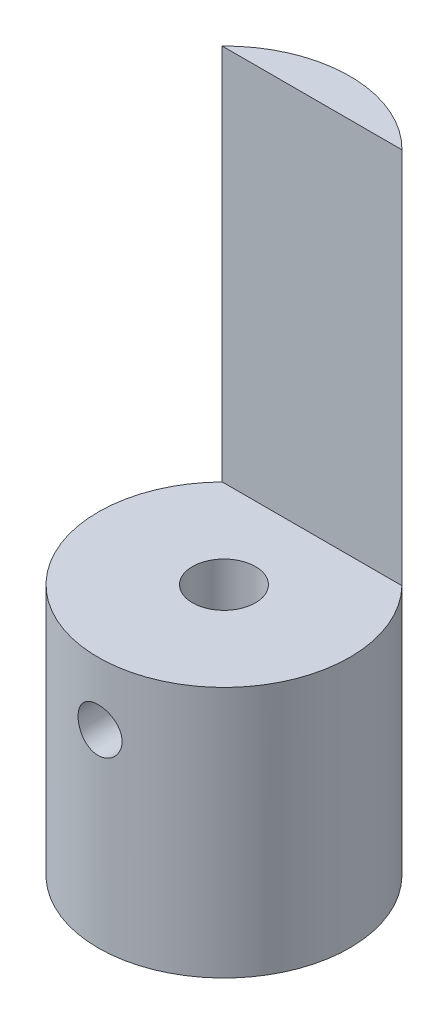
ISO-10303-21;
HEADER;
FILE_DESCRIPTION(('STEP AP214'),'2;1');
FILE_NAME('part.step','',(''),(''),'','','');
FILE_SCHEMA(('AUTOMOTIVE_DESIGN { 1 0 10303 214 1 1 1 1 }'));
ENDSEC;
DATA;
#1=APPLICATION_CONTEXT('core data for automotive mechanical design processes');
#2=APPLICATION_PROTOCOL_DEFINITION('international standard','automotive_design',2000,#1);
#3=PRODUCT_CONTEXT('',#1,'mechanical');
#4=PRODUCT('Part','Part','',(#3));
#5=PRODUCT_RELATED_PRODUCT_CATEGORY('part','',(#4));
#6=PRODUCT_DEFINITION_FORMATION('','',#4);
#7=PRODUCT_DEFINITION_CONTEXT('part definition',#1,'design');
#8=PRODUCT_DEFINITION('design','',#6,#7);
#9=PRODUCT_DEFINITION_SHAPE('','',#8);
#10=(LENGTH_UNIT() NAMED_UNIT(*) SI_UNIT(.MILLI.,.METRE.));
#11=(NAMED_UNIT(*) PLANE_ANGLE_UNIT() SI_UNIT($,.RADIAN.));
#12=(NAMED_UNIT(*) SI_UNIT($,.STERADIAN.) SOLID_ANGLE_UNIT());
#13=UNCERTAINTY_MEASURE_WITH_UNIT(LENGTH_MEASURE(1.E-05),#10,'distance_accuracy_value','');
#14=(GEOMETRIC_REPRESENTATION_CONTEXT(3) GLOBAL_UNCERTAINTY_ASSIGNED_CONTEXT((#13)) GLOBAL_UNIT_ASSIGNED_CONTEXT((#10,
#11,#12)) REPRESENTATION_CONTEXT('',''));
#15=CARTESIAN_POINT('',(0.,0.,0.));
#16=DIRECTION('',(0.,0.,1.));
#17=DIRECTION('',(1.,0.,0.));
#18=AXIS2_PLACEMENT_3D('',#15,#16,#17);
#19=CARTESIAN_POINT('',(0.,-25.,0.));
#20=DIRECTION('',(0.,1.,0.));
#21=DIRECTION('',(0.,0.,1.));
#22=AXIS2_PLACEMENT_3D('',#19,#20,#21);
#23=CYLINDRICAL_SURFACE('',#22,2.5);
#24=CARTESIAN_POINT('',(1.75,-10.,1.78535710713571));
#25=CARTESIAN_POINT('',(1.74999668470245,-10.0840009850811,1.78536365232842));
#26=CARTESIAN_POINT('',(1.74389521209419,-10.1680204393146,1.79140301018335));
#27=CARTESIAN_POINT('',(1.72006710575697,-10.332943837299,1.81428207856453));
#28=CARTESIAN_POINT('',(1.70231462478914,-10.4138404296418,1.83114580062351));
#29=CARTESIAN_POINT('',(1.65670498667528,-10.5695149360926,1.87249938059927));
#30=CARTESIAN_POINT('',(1.62896126458866,-10.6443504232069,1.89690320720833));
#31=CARTESIAN_POINT('',(1.56446804264321,-10.7881331754813,1.95043473735259));
#32=CARTESIAN_POINT('',(1.52771791559368,-10.8570800301159,1.97956276982564));
#33=CARTESIAN_POINT('',(1.43878621662413,-11.0003478137376,2.04535102275824));
#34=CARTESIAN_POINT('',(1.38502929897584,-11.0734953994,2.08243700207531));
#35=CARTESIAN_POINT('',(1.26677845799128,-11.2107803348271,2.1564208214175));
#36=CARTESIAN_POINT('',(1.20227131618142,-11.2749064104854,2.19331837146343));
#37=CARTESIAN_POINT('',(1.05144375296211,-11.4029656722092,2.26996924261653));
#38=CARTESIAN_POINT('',(0.963279690235144,-11.465088149001,2.30917478390817));
#39=CARTESIAN_POINT('',(0.774507144866145,-11.5730193471834,2.37911884375226));
#40=CARTESIAN_POINT('',(0.673924100801021,-11.6188606949663,2.40987426748605));
#41=CARTESIAN_POINT('',(0.491641621204738,-11.6814947086473,2.45245937204221));
#42=CARTESIAN_POINT('',(0.412145254198867,-11.7027848997145,2.46715488574729));
#43=CARTESIAN_POINT('',(0.249941853155885,-11.7340218577379,2.4888153213972));
#44=CARTESIAN_POINT('',(0.167237437370551,-11.7439776818789,2.49578641573295));
#45=CARTESIAN_POINT('',(0.000805953099354163,-11.7519859118395,2.50138893131687));
#46=CARTESIAN_POINT('',(-0.0829227873690327,-11.7500151994238,2.50000415567629));
#47=CARTESIAN_POINT('',(-0.248708367620931,-11.7342380604739,2.48898580019574));
#48=CARTESIAN_POINT('',(-0.33076473464533,-11.7204283334349,2.47934992009681));
#49=CARTESIAN_POINT('',(-0.489091678965587,-11.6821939876583,2.45297594957067));
#50=CARTESIAN_POINT('',(-0.565451554473572,-11.6580187786463,2.43640494040199));
#51=CARTESIAN_POINT('',(-0.712866124373186,-11.600186849406,2.3974241748025));
#52=CARTESIAN_POINT('',(-0.783919773088347,-11.5665282665328,2.37501327141354));
#53=CARTESIAN_POINT('',(-0.927364948854817,-11.4865982282535,2.32302570425101));
#54=CARTESIAN_POINT('',(-0.999011535436182,-11.4393351345961,2.2929270864848));
#55=CARTESIAN_POINT('',(-1.13380163072983,-11.335751894994,2.22936304366409));
#56=CARTESIAN_POINT('',(-1.19693584549685,-11.2794219945808,2.1958940072484));
#57=CARTESIAN_POINT('',(-1.32466884852146,-11.1478683695018,2.1217040880619));
#58=CARTESIAN_POINT('',(-1.38751556001383,-11.0710670049214,2.08075557422617));
#59=CARTESIAN_POINT('',(-1.49986258412796,-10.907075420374,2.00128404549408));
#60=CARTESIAN_POINT('',(-1.54936634540833,-10.8198878932622,1.96276040583434));
#61=CARTESIAN_POINT('',(-1.62379387354891,-10.6571390742002,1.90133168615619));
#62=CARTESIAN_POINT('',(-1.6517550759101,-10.5835620954979,1.87687572628151));
#63=CARTESIAN_POINT('',(-1.69783359991293,-10.4314530632095,1.83530095032362));
#64=CARTESIAN_POINT('',(-1.71596933120923,-10.3529305862811,1.81816842537049));
#65=CARTESIAN_POINT('',(-1.7413948338882,-10.1917099745946,1.79384395713168));
#66=CARTESIAN_POINT('',(-1.74857289482399,-10.1089776028031,1.78675445152956));
#67=CARTESIAN_POINT('',(-1.7510385880738,-9.94317097607153,1.78434054379133));
#68=CARTESIAN_POINT('',(-1.74633055521635,-9.86009685679791,1.78901185251409));
#69=CARTESIAN_POINT('',(-1.72696239874666,-9.70820930977384,1.80768760487068));
#70=CARTESIAN_POINT('',(-1.71377642758929,-9.6390186016851,1.8203046319629));
#71=CARTESIAN_POINT('',(-1.67969499612499,-9.50403816283819,1.8517999024481));
#72=CARTESIAN_POINT('',(-1.65879140787065,-9.43825210132994,1.87068474477725));
#73=CARTESIAN_POINT('',(-1.59852896713013,-9.28077034820005,1.92274158237606));
#74=CARTESIAN_POINT('',(-1.55511505325272,-9.19146803919049,1.95845312500197));
#75=CARTESIAN_POINT('',(-1.45492648517439,-9.02257282529333,2.03399599544424));
#76=CARTESIAN_POINT('',(-1.39812571684051,-8.94299936548852,2.07383528916823));
#77=CARTESIAN_POINT('',(-1.27092510286979,-8.7928957792087,2.15418669583295));
#78=CARTESIAN_POINT('',(-1.20028884551029,-8.72256465844527,2.1946973173828));
#79=CARTESIAN_POINT('',(-1.04691346170574,-8.59413851518448,2.27185413151566));
#80=CARTESIAN_POINT('',(-0.964192388100275,-8.53602555111755,2.30850595042205));
#81=CARTESIAN_POINT('',(-0.801972977832247,-8.44223142992906,2.36919526820175));
#82=CARTESIAN_POINT('',(-0.724101828752617,-8.40444480691776,2.39431368424312));
#83=CARTESIAN_POINT('',(-0.561899898340574,-8.34037477182327,2.43747683045928));
#84=CARTESIAN_POINT('',(-0.477573071991882,-8.31408438195673,2.45552585079696));
#85=CARTESIAN_POINT('',(-0.304026348647538,-8.27430272688604,2.48300657254176));
#86=CARTESIAN_POINT('',(-0.214781260897283,-8.26088540426302,2.4923884789659));
#87=CARTESIAN_POINT('',(-0.0348055388819863,-8.24802501832627,2.50137827965738));
#88=CARTESIAN_POINT('',(0.0559245021160286,-8.24857650413176,2.50098998643309));
#89=CARTESIAN_POINT('',(0.226908148208797,-8.26285949256848,2.49101138192816));
#90=CARTESIAN_POINT('',(0.307326916753023,-8.27531226870284,2.48231388173466));
#91=CARTESIAN_POINT('',(0.464612376244546,-8.31087611828671,2.45773771003211));
#92=CARTESIAN_POINT('',(0.541478388403849,-8.33398921930747,2.44185767243074));
#93=CARTESIAN_POINT('',(0.692630046920317,-8.39080323386533,2.40344767867576));
#94=CARTESIAN_POINT('',(0.766731128366447,-8.42484651008378,2.38070436495182));
#95=CARTESIAN_POINT('',(0.908240418312741,-8.50196779410319,2.33039638985978));
#96=CARTESIAN_POINT('',(0.97564732844293,-8.54504754955408,2.3028307960369));
#97=CARTESIAN_POINT('',(1.11310524604694,-8.6465245392116,2.23999116004928));
#98=CARTESIAN_POINT('',(1.18192132257828,-8.70626361794321,2.20418577912312));
#99=CARTESIAN_POINT('',(1.30924982295531,-8.83526808263679,2.13102660052162));
#100=CARTESIAN_POINT('',(1.36774022884758,-8.90455327764107,2.09366969893854));
#101=CARTESIAN_POINT('',(1.48204711893857,-9.0634720055012,2.01471303450108));
#102=CARTESIAN_POINT('',(1.53599603072894,-9.15459200750297,1.9733701022534));
#103=CARTESIAN_POINT('',(1.627377581911,-9.3477205059177,1.89871813385105));
#104=CARTESIAN_POINT('',(1.66486028939109,-9.44969480667085,1.86538488501278));
#105=CARTESIAN_POINT('',(1.71142779429956,-9.62726530873243,1.82254477153272));
#106=CARTESIAN_POINT('',(1.72580405858133,-9.70043849135374,1.80880418551828));
#107=CARTESIAN_POINT('',(1.74508336851488,-9.8490723032766,1.79021518690061));
#108=CARTESIAN_POINT('',(1.75000297865347,-9.92452869725181,1.78535122655919));
#109=CARTESIAN_POINT('',(1.75,-10.,1.78535710713571));
#110=B_SPLINE_CURVE_WITH_KNOTS('',3,(#24,#25,#26,#27,#28,#29,#30,#31,#32,#33,#34,#35,#36,#37,
#38,#39,#40,#41,#42,#43,#44,#45,#46,#47,#48,#49,#50,#51,#52,#53,#54,#55,#56,#57,#58,#59,#60,#61,
#62,#63,#64,#65,#66,#67,#68,#69,#70,#71,#72,#73,#74,#75,#76,#77,#78,#79,#80,#81,#82,#83,#84,#85,
#86,#87,#88,#89,#90,#91,#92,#93,#94,#95,#96,#97,#98,#99,#100,#101,#102,#103,#104,#105,#106,#107,
#108,#109),.UNSPECIFIED.,.T.,.F.,(4,2,2,2,2,2,2,2,2,2,2,2,2,2,2,2,2,2,2,2,2,2,2,2,2,2,2,2,2,2,2,
2,2,2,2,2,2,2,2,2,2,2,4),(0.,0.251644352862941,0.503848863092812,0.753275865950746,
1.00272024341801,1.29584807815701,1.58933903876421,1.93170814842452,2.27338724778376,
2.52311133695241,2.77263573360097,3.02264395964273,3.27272190616391,3.51709337531477,
3.76151287536607,4.03336573621144,4.30551304756613,4.62626324788577,4.94693046648402,
5.19332741197632,5.43926108098983,5.68768561592647,5.93601956414821,6.14983844698568,
6.36388316239659,6.67875939439456,6.99425502444263,7.31570467879083,7.63667895652621,
7.90595122268597,8.17505982302552,8.44570508287669,8.7162447336979,8.9606422999123,
9.20508636920796,9.45808878225994,9.71114017102311,10.003763719812,10.2970038996666,
10.6363668560714,10.9746906604828,11.201179465444,11.427271184743),.UNSPECIFIED.);
#111=CARTESIAN_POINT('',(1.75,-10.,1.78535710713571));
#112=VERTEX_POINT('',#111);
#113=EDGE_CURVE('E69',#112,#112,#110,.T.);
#114=ORIENTED_EDGE('',*,*,#113,.F.);
#115=EDGE_LOOP('',(#114));
#116=FACE_BOUND('',#115,.T.);
#117=CARTESIAN_POINT('',(0.,-25.,0.));
#118=DIRECTION('',(0.,1.,0.));
#119=DIRECTION('',(0.,0.,1.));
#120=AXIS2_PLACEMENT_3D('',#117,#118,#119);
#121=CIRCLE('',#120,2.5);
#122=CARTESIAN_POINT('',(0.,-25.,2.5));
#123=VERTEX_POINT('',#122);
#124=EDGE_CURVE('E119',#123,#123,#121,.T.);
#125=ORIENTED_EDGE('',*,*,#124,.F.);
#126=EDGE_LOOP('',(#125));
#127=FACE_BOUND('',#126,.T.);
#128=CARTESIAN_POINT('',(0.,-5.,0.));
#129=DIRECTION('',(0.,1.,0.));
#130=DIRECTION('',(0.,0.,1.));
#131=AXIS2_PLACEMENT_3D('',#128,#129,#130);
#132=CIRCLE('',#131,2.5);
#133=CARTESIAN_POINT('',(0.,-5.,2.5));
#134=VERTEX_POINT('',#133);
#135=EDGE_CURVE('E40',#134,#134,#132,.F.);
#136=ORIENTED_EDGE('',*,*,#135,.F.);
#137=EDGE_LOOP('',(#136));
#138=FACE_BOUND('',#137,.T.);
#139=ADVANCED_FACE('F36',(#116,#127,#138),#23,.F.);
#140=CARTESIAN_POINT('',(0.,25.,0.));
#141=DIRECTION('',(0.,-1.,0.));
#142=DIRECTION('',(0.,0.,-1.));
#143=AXIS2_PLACEMENT_3D('',#140,#141,#142);
#144=CYLINDRICAL_SURFACE('',#143,10.);
#145=CARTESIAN_POINT('',(1.75,-10.,9.84568433375761));
#146=CARTESIAN_POINT('',(1.74999614707769,-9.9025126674052,9.84568614971877));
#147=CARTESIAN_POINT('',(1.7418262952061,-9.80497391649136,9.84714794833416));
#148=CARTESIAN_POINT('',(1.7093799629126,-9.6126384227064,9.85283112133241));
#149=CARTESIAN_POINT('',(1.68508908929617,-9.51784420921911,9.85705496167591));
#150=CARTESIAN_POINT('',(1.62116248086999,-9.33380890680261,9.86776951325615));
#151=CARTESIAN_POINT('',(1.58154013691065,-9.24456305054868,9.87425824580223));
#152=CARTESIAN_POINT('',(1.48810953050795,-9.0739938433928,9.88876912660767));
#153=CARTESIAN_POINT('',(1.43430267431371,-8.99266970822728,9.89679112283797));
#154=CARTESIAN_POINT('',(1.313407558621,-8.83936134491281,9.91356194372765));
#155=CARTESIAN_POINT('',(1.24619527573239,-8.76747559450918,9.92231707580156));
#156=CARTESIAN_POINT('',(1.10066526787948,-8.63594096009067,9.93951178241083));
#157=CARTESIAN_POINT('',(1.02234685846791,-8.57629283080946,9.94795133745731));
#158=CARTESIAN_POINT('',(0.85618620809184,-8.47055395281981,9.96363106264343));
#159=CARTESIAN_POINT('',(0.768284492208795,-8.42455533040076,9.97086294471024));
#160=CARTESIAN_POINT('',(0.585853799604157,-8.34801388228394,9.98324213395081));
#161=CARTESIAN_POINT('',(0.491325298172318,-8.31746994942552,9.98838959044574));
#162=CARTESIAN_POINT('',(0.299343066316544,-8.27300742272112,9.99597541274984));
#163=CARTESIAN_POINT('',(0.201928793544093,-8.2589231358463,9.99844076058663));
#164=CARTESIAN_POINT('',(0.00609074034883649,-8.24726406525765,10.0004774070068));
#165=CARTESIAN_POINT('',(-0.0923329641997522,-8.24968804964539,10.0000489215371));
#166=CARTESIAN_POINT('',(-0.286261787878404,-8.27084832383978,9.99636743323528));
#167=CARTESIAN_POINT('',(-0.381787038143536,-8.28940626111869,9.99314531364367));
#168=CARTESIAN_POINT('',(-0.568346432353333,-8.34202632998025,9.98427309789633));
#169=CARTESIAN_POINT('',(-0.659380428661258,-8.37608897085846,9.9786229219846));
#170=CARTESIAN_POINT('',(-0.834898543664969,-8.45892594329279,9.96547722388572));
#171=CARTESIAN_POINT('',(-0.919347671813219,-8.50777291490549,9.9579726245404));
#172=CARTESIAN_POINT('',(-1.07891760175991,-8.61873863083724,9.94195038789881));
#173=CARTESIAN_POINT('',(-1.15403757240155,-8.68085855633593,9.9334326604727));
#174=CARTESIAN_POINT('',(-1.29387175378861,-8.81759360429633,9.91619557457141));
#175=CARTESIAN_POINT('',(-1.35843341984165,-8.8923646757315,9.9074750428737));
#176=CARTESIAN_POINT('',(-1.47412052948707,-9.05175640659301,9.89092484526781));
#177=CARTESIAN_POINT('',(-1.52524582320742,-9.1363771758697,9.8830951892972));
#178=CARTESIAN_POINT('',(-1.61264408867291,-9.31325289577408,9.86921219314739));
#179=CARTESIAN_POINT('',(-1.64889723053681,-9.4055178431862,9.86316122762236));
#180=CARTESIAN_POINT('',(-1.70534655701126,-9.59495796294738,9.85355879963018));
#181=CARTESIAN_POINT('',(-1.72554431041425,-9.692132654572,9.85000709296117));
#182=CARTESIAN_POINT('',(-1.74909167072955,-9.88726482977243,9.84585299926953));
#183=CARTESIAN_POINT('',(-1.75265938935999,-9.98519520545911,9.84521243389554));
#184=CARTESIAN_POINT('',(-1.74342797042691,-10.1802531937449,9.84685127712912));
#185=CARTESIAN_POINT('',(-1.73062953293436,-10.2773808405022,9.84913056083862));
#186=CARTESIAN_POINT('',(-1.68921556854974,-10.4673741090453,9.85631689910622));
#187=CARTESIAN_POINT('',(-1.66071234224035,-10.5602649784536,9.86120528899016));
#188=CARTESIAN_POINT('',(-1.58881621009288,-10.7399519987381,9.87304321959131));
#189=CARTESIAN_POINT('',(-1.54542233233126,-10.826747751336,9.87999289484608));
#190=CARTESIAN_POINT('',(-1.44446686852147,-10.9927476531848,9.89525837117709));
#191=CARTESIAN_POINT('',(-1.38676627772465,-11.0718660358355,9.90358729231133));
#192=CARTESIAN_POINT('',(-1.25902478392813,-11.2193759108595,9.92063500418771));
#193=CARTESIAN_POINT('',(-1.1889829202078,-11.2877665673365,9.9293538252426));
#194=CARTESIAN_POINT('',(-1.03757773333283,-11.4126831900268,9.94632045663045));
#195=CARTESIAN_POINT('',(-0.956093151851284,-11.4690632182896,9.95456167481406));
#196=CARTESIAN_POINT('',(-0.78468202376801,-11.56733296601,9.96953684410525));
#197=CARTESIAN_POINT('',(-0.694755771398283,-11.6092231902674,9.97627084771867));
#198=CARTESIAN_POINT('',(-0.509435756884874,-11.6771004381826,9.98744431327328));
#199=CARTESIAN_POINT('',(-0.414069973569286,-11.7031620058661,9.99189451501047));
#200=CARTESIAN_POINT('',(-0.220230515016628,-11.7388814120089,9.99804452672039));
#201=CARTESIAN_POINT('',(-0.121757123740523,-11.7485407448445,9.99974458725255));
#202=CARTESIAN_POINT('',(0.0740972279384975,-11.7511349878834,10.0001986676664));
#203=CARTESIAN_POINT('',(0.17147523552859,-11.7442913038633,9.9989916888787));
#204=CARTESIAN_POINT('',(0.363671714431676,-11.7145549982948,9.99384747273868));
#205=CARTESIAN_POINT('',(0.458490203795065,-11.6916624899576,9.98991025464598));
#206=CARTESIAN_POINT('',(0.642778931888431,-11.6305666268592,9.97974688526102));
#207=CARTESIAN_POINT('',(0.732256205080809,-11.592383944614,9.97352382539293));
#208=CARTESIAN_POINT('',(0.903568024982699,-11.5018169358253,9.95946589247331));
#209=CARTESIAN_POINT('',(0.985402149898063,-11.4494318261296,9.95163093054382));
#210=CARTESIAN_POINT('',(1.14021551395227,-11.3311708115637,9.93509204541497));
#211=CARTESIAN_POINT('',(1.21307049932053,-11.2651335847967,9.9263784362471));
#212=CARTESIAN_POINT('',(1.34674250927088,-11.1217801885222,9.90912905327679));
#213=CARTESIAN_POINT('',(1.40755670839287,-11.0444613790832,9.90059332163408));
#214=CARTESIAN_POINT('',(1.51586622368385,-10.8800123132252,9.88459302297716));
#215=CARTESIAN_POINT('',(1.56325260200568,-10.7928094180086,9.87713744439718));
#216=CARTESIAN_POINT('',(1.64262974084897,-10.6115831313708,9.86424848595999));
#217=CARTESIAN_POINT('',(1.6746355562061,-10.5175665135605,9.8588131298501));
#218=CARTESIAN_POINT('',(1.71556325785051,-10.3526805338023,9.85175783194062));
#219=CARTESIAN_POINT('',(1.72845578041526,-10.2827974620357,9.84949326196896));
#220=CARTESIAN_POINT('',(1.74567546273085,-10.1419519998908,9.84645586764426));
#221=CARTESIAN_POINT('',(1.75000280567262,-10.0709896326292,9.84568301138667));
#222=CARTESIAN_POINT('',(1.75,-10.,9.84568433375761));
#223=B_SPLINE_CURVE_WITH_KNOTS('',3,(#145,#146,#147,#148,#149,#150,#151,#152,#153,#154,#155,
#156,#157,#158,#159,#160,#161,#162,#163,#164,#165,#166,#167,#168,#169,#170,#171,#172,#173,#174,
#175,#176,#177,#178,#179,#180,#181,#182,#183,#184,#185,#186,#187,#188,#189,#190,#191,#192,#193,
#194,#195,#196,#197,#198,#199,#200,#201,#202,#203,#204,#205,#206,#207,#208,#209,#210,#211,#212,
#213,#214,#215,#216,#217,#218,#219,#220,#221,#222),.UNSPECIFIED.,.T.,.F.,(4,2,2,2,2,2,2,2,2,2,2,
2,2,2,2,2,2,2,2,2,2,2,2,2,2,2,2,2,2,2,2,2,2,2,2,2,2,2,4),(0.,0.292202329923689,
0.584665895961619,0.876874592267837,1.16905432996191,1.4640743349544,1.75911252931879,
2.05609898984408,2.3530641715019,2.64701343935409,2.94094077204019,3.2316596197882,
3.52238801770299,3.8145687056272,4.10677540597687,4.40288870912172,4.69900531503459,
4.99551547662587,5.29199666226917,5.58457818931964,5.87714720145928,6.16765078589467,
6.45817333531593,6.75163754038525,7.04512460061544,7.34199657440749,7.63885820465188,
7.93431071913839,8.22973631406723,8.52122055640011,8.81270274257226,9.1037921644007,
9.3948976407859,9.68966278421802,9.98449701472035,10.2816588511069,10.5785292234368,
10.7913135839539,11.004093393418),.UNSPECIFIED.);
#224=CARTESIAN_POINT('',(1.75,-10.,9.84568433375761));
#225=VERTEX_POINT('',#224);
#226=EDGE_CURVE('E109',#225,#225,#223,.T.);
#227=ORIENTED_EDGE('',*,*,#226,.F.);
#228=EDGE_LOOP('',(#227));
#229=FACE_BOUND('',#228,.T.);
#230=CARTESIAN_POINT('',(0.,25.,0.));
#231=DIRECTION('',(0.,1.,0.));
#232=DIRECTION('',(0.,0.,1.));
#233=AXIS2_PLACEMENT_3D('',#230,#231,#232);
#234=CIRCLE('',#233,10.);
#235=CARTESIAN_POINT('',(7.14142842854285,25.,-7.));
#236=VERTEX_POINT('',#235);
#237=CARTESIAN_POINT('',(-7.14142842854285,25.,-7.));
#238=VERTEX_POINT('',#237);
#239=EDGE_CURVE('E11',#236,#238,#234,.T.);
#240=ORIENTED_EDGE('',*,*,#239,.F.);
#241=DIRECTION('',(0.,1.,0.));
#242=VECTOR('',#241,1.);
#243=CARTESIAN_POINT('',(7.14142842854285,-5.,-7.));
#244=LINE('',#243,#242);
#245=CARTESIAN_POINT('',(7.14142842854285,-5.,-7.));
#246=VERTEX_POINT('',#245);
#247=EDGE_CURVE('E53',#246,#236,#244,.T.);
#248=ORIENTED_EDGE('',*,*,#247,.F.);
#249=CARTESIAN_POINT('',(0.,-5.,0.));
#250=DIRECTION('',(0.,1.,0.));
#251=DIRECTION('',(0.,0.,1.));
#252=AXIS2_PLACEMENT_3D('',#249,#250,#251);
#253=CIRCLE('',#252,10.);
#254=CARTESIAN_POINT('',(-7.14142842854285,-5.,-7.));
#255=VERTEX_POINT('',#254);
#256=EDGE_CURVE('E68',#255,#246,#253,.T.);
#257=ORIENTED_EDGE('',*,*,#256,.F.);
#258=DIRECTION('',(0.,1.,0.));
#259=VECTOR('',#258,1.);
#260=CARTESIAN_POINT('',(-7.14142842854285,-5.,-7.));
#261=LINE('',#260,#259);
#262=EDGE_CURVE('E59',#255,#238,#261,.T.);
#263=ORIENTED_EDGE('',*,*,#262,.T.);
#264=EDGE_LOOP('',(#240,#248,#257,#263));
#265=FACE_BOUND('',#264,.T.);
#266=CARTESIAN_POINT('',(0.,-25.,0.));
#267=DIRECTION('',(0.,1.,0.));
#268=DIRECTION('',(0.,0.,1.));
#269=AXIS2_PLACEMENT_3D('',#266,#267,#268);
#270=CIRCLE('',#269,10.);
#271=CARTESIAN_POINT('',(0.,-25.,10.));
#272=VERTEX_POINT('',#271);
#273=EDGE_CURVE('E45',#272,#272,#270,.T.);
#274=ORIENTED_EDGE('',*,*,#273,.T.);
#275=EDGE_LOOP('',(#274));
#276=FACE_BOUND('',#275,.T.);
#277=ADVANCED_FACE('F38',(#229,#265,#276),#144,.T.);
#278=CARTESIAN_POINT('',(0.,25.,0.));
#279=DIRECTION('',(0.,1.,0.));
#280=DIRECTION('',(0.,0.,1.));
#281=AXIS2_PLACEMENT_3D('',#278,#279,#280);
#282=PLANE('',#281);
#283=DIRECTION('',(-1.,0.,0.));
#284=VECTOR('',#283,1.);
#285=CARTESIAN_POINT('',(-7.14142842854285,25.,-7.));
#286=LINE('',#285,#284);
#287=EDGE_CURVE('E64',#236,#238,#286,.T.);
#288=ORIENTED_EDGE('',*,*,#287,.F.);
#289=ORIENTED_EDGE('',*,*,#239,.T.);
#290=EDGE_LOOP('',(#288,#289));
#291=FACE_BOUND('',#290,.T.);
#292=ADVANCED_FACE('F75',(#291),#282,.T.);
#293=CARTESIAN_POINT('',(0.,-25.,0.));
#294=DIRECTION('',(0.,1.,0.));
#295=DIRECTION('',(0.,0.,1.));
#296=AXIS2_PLACEMENT_3D('',#293,#294,#295);
#297=PLANE('',#296);
#298=ORIENTED_EDGE('',*,*,#124,.T.);
#299=EDGE_LOOP('',(#298));
#300=FACE_BOUND('',#299,.T.);
#301=ORIENTED_EDGE('',*,*,#273,.F.);
#302=EDGE_LOOP('',(#301));
#303=FACE_BOUND('',#302,.T.);
#304=ADVANCED_FACE('F77',(#300,#303),#297,.F.);
#305=CARTESIAN_POINT('',(0.,-5.,0.));
#306=DIRECTION('',(0.,1.,0.));
#307=DIRECTION('',(0.,0.,1.));
#308=AXIS2_PLACEMENT_3D('',#305,#306,#307);
#309=PLANE('',#308);
#310=ORIENTED_EDGE('',*,*,#256,.T.);
#311=DIRECTION('',(-1.,0.,0.));
#312=VECTOR('',#311,1.);
#313=CARTESIAN_POINT('',(-7.14142842854285,-5.,-7.));
#314=LINE('',#313,#312);
#315=EDGE_CURVE('E116',#246,#255,#314,.T.);
#316=ORIENTED_EDGE('',*,*,#315,.T.);
#317=EDGE_LOOP('',(#310,#316));
#318=FACE_BOUND('',#317,.T.);
#319=ORIENTED_EDGE('',*,*,#135,.T.);
#320=EDGE_LOOP('',(#319));
#321=FACE_BOUND('',#320,.T.);
#322=ADVANCED_FACE('F83',(#318,#321),#309,.T.);
#323=CARTESIAN_POINT('',(-7.14142842854285,-5.,-7.));
#324=DIRECTION('',(0.,0.,-1.));
#325=DIRECTION('',(-1.,0.,0.));
#326=AXIS2_PLACEMENT_3D('',#323,#324,#325);
#327=PLANE('',#326);
#328=ORIENTED_EDGE('',*,*,#287,.T.);
#329=ORIENTED_EDGE('',*,*,#262,.F.);
#330=ORIENTED_EDGE('',*,*,#315,.F.);
#331=ORIENTED_EDGE('',*,*,#247,.T.);
#332=EDGE_LOOP('',(#328,#329,#330,#331));
#333=FACE_BOUND('',#332,.T.);
#334=ADVANCED_FACE('F65',(#333),#327,.F.);
#335=CARTESIAN_POINT('',(0.,-10.,-10.001));
#336=DIRECTION('',(0.,0.,1.));
#337=DIRECTION('',(1.,0.,0.));
#338=AXIS2_PLACEMENT_3D('',#335,#336,#337);
#339=CYLINDRICAL_SURFACE('',#338,1.75);
#340=ORIENTED_EDGE('',*,*,#226,.T.);
#341=EDGE_LOOP('',(#340));
#342=FACE_BOUND('',#341,.T.);
#343=ORIENTED_EDGE('',*,*,#113,.T.);
#344=EDGE_LOOP('',(#343));
#345=FACE_BOUND('',#344,.T.);
#346=ADVANCED_FACE('F96',(#342,#345),#339,.F.);
#347=CLOSED_SHELL('',(#139,#277,#292,#304,#322,#334,#346));
#348=MANIFOLD_SOLID_BREP('B2',#347);
#349=ADVANCED_BREP_SHAPE_REPRESENTATION('',(#18,#348),#14);
#350=SHAPE_DEFINITION_REPRESENTATION(#9,#349);
ENDSEC;
END-ISO-10303-21;
